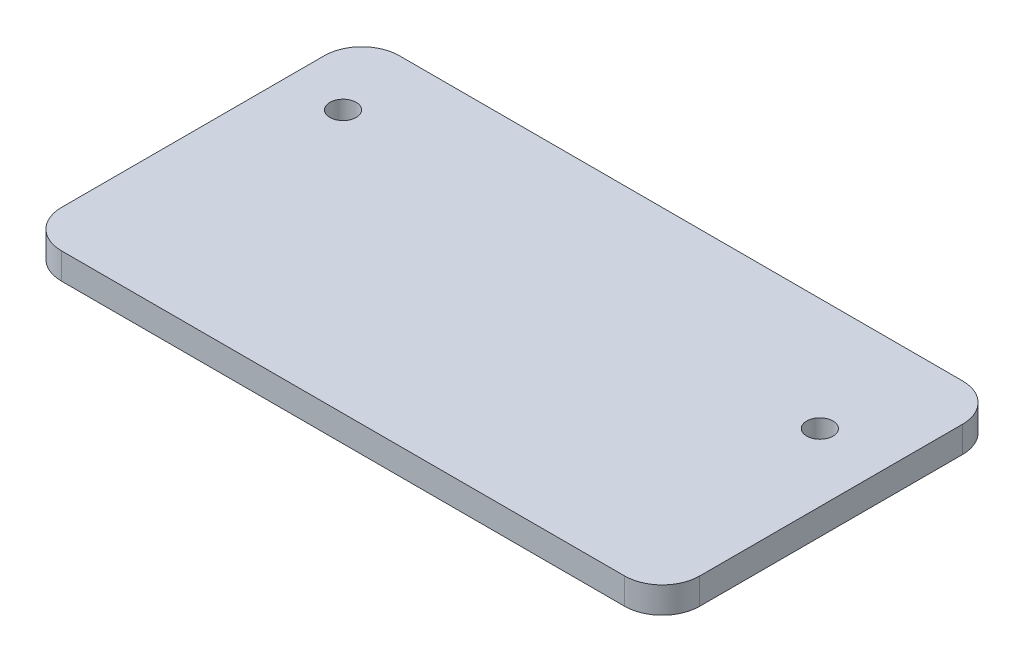
ISO-10303-21;
HEADER;
FILE_DESCRIPTION(('STEP AP214'),'2;1');
FILE_NAME('part.step','',(''),(''),'','','');
FILE_SCHEMA(('AUTOMOTIVE_DESIGN { 1 0 10303 214 1 1 1 1 }'));
ENDSEC;
DATA;
#1=APPLICATION_CONTEXT('core data for automotive mechanical design processes');
#2=APPLICATION_PROTOCOL_DEFINITION('international standard','automotive_design',2000,#1);
#3=PRODUCT_CONTEXT('',#1,'mechanical');
#4=PRODUCT('Part','Part','',(#3));
#5=PRODUCT_RELATED_PRODUCT_CATEGORY('part','',(#4));
#6=PRODUCT_DEFINITION_FORMATION('','',#4);
#7=PRODUCT_DEFINITION_CONTEXT('part definition',#1,'design');
#8=PRODUCT_DEFINITION('design','',#6,#7);
#9=PRODUCT_DEFINITION_SHAPE('','',#8);
#10=(LENGTH_UNIT() NAMED_UNIT(*) SI_UNIT(.MILLI.,.METRE.));
#11=(NAMED_UNIT(*) PLANE_ANGLE_UNIT() SI_UNIT($,.RADIAN.));
#12=(NAMED_UNIT(*) SI_UNIT($,.STERADIAN.) SOLID_ANGLE_UNIT());
#13=UNCERTAINTY_MEASURE_WITH_UNIT(LENGTH_MEASURE(1.E-05),#10,'distance_accuracy_value','');
#14=(GEOMETRIC_REPRESENTATION_CONTEXT(3) GLOBAL_UNCERTAINTY_ASSIGNED_CONTEXT((#13)) GLOBAL_UNIT_ASSIGNED_CONTEXT((#10,
#11,#12)) REPRESENTATION_CONTEXT('',''));
#15=CARTESIAN_POINT('',(0.,0.,0.));
#16=DIRECTION('',(0.,0.,1.));
#17=DIRECTION('',(1.,0.,0.));
#18=AXIS2_PLACEMENT_3D('',#15,#16,#17);
#19=CARTESIAN_POINT('',(-37.5,3.5,-17.5));
#20=DIRECTION('',(0.,-1.,0.));
#21=DIRECTION('',(0.,0.,-1.));
#22=AXIS2_PLACEMENT_3D('',#19,#20,#21);
#23=PLANE('',#22);
#24=CARTESIAN_POINT('',(-37.5,3.5,-17.5));
#25=DIRECTION('',(0.,-1.,0.));
#26=DIRECTION('',(0.,0.,-1.));
#27=AXIS2_PLACEMENT_3D('',#24,#25,#26);
#28=CIRCLE('',#27,5.);
#29=CARTESIAN_POINT('',(-42.5,3.5,-17.5));
#30=VERTEX_POINT('',#29);
#31=CARTESIAN_POINT('',(-37.5,3.5,-22.5));
#32=VERTEX_POINT('',#31);
#33=EDGE_CURVE('E227',#30,#32,#28,.T.);
#34=ORIENTED_EDGE('',*,*,#33,.F.);
#35=DIRECTION('',(0.,0.,1.));
#36=VECTOR('',#35,1.);
#37=CARTESIAN_POINT('',(-42.5,3.5,-17.5));
#38=LINE('',#37,#36);
#39=CARTESIAN_POINT('',(-42.5,3.5,17.5));
#40=VERTEX_POINT('',#39);
#41=EDGE_CURVE('E192',#30,#40,#38,.T.);
#42=ORIENTED_EDGE('',*,*,#41,.T.);
#43=CARTESIAN_POINT('',(-37.5,3.5,17.5));
#44=DIRECTION('',(0.,-1.,0.));
#45=DIRECTION('',(0.,0.,-1.));
#46=AXIS2_PLACEMENT_3D('',#43,#44,#45);
#47=CIRCLE('',#46,5.);
#48=CARTESIAN_POINT('',(-37.5,3.5,22.5));
#49=VERTEX_POINT('',#48);
#50=EDGE_CURVE('E172',#49,#40,#47,.T.);
#51=ORIENTED_EDGE('',*,*,#50,.F.);
#52=DIRECTION('',(1.,0.,0.));
#53=VECTOR('',#52,1.);
#54=CARTESIAN_POINT('',(-37.5,3.5,22.5));
#55=LINE('',#54,#53);
#56=CARTESIAN_POINT('',(37.5,3.5,22.5));
#57=VERTEX_POINT('',#56);
#58=EDGE_CURVE('E182',#49,#57,#55,.T.);
#59=ORIENTED_EDGE('',*,*,#58,.T.);
#60=CARTESIAN_POINT('',(37.5,3.5,17.5));
#61=DIRECTION('',(0.,-1.,0.));
#62=DIRECTION('',(0.,0.,-1.));
#63=AXIS2_PLACEMENT_3D('',#60,#61,#62);
#64=CIRCLE('',#63,5.);
#65=CARTESIAN_POINT('',(42.5,3.5,17.5));
#66=VERTEX_POINT('',#65);
#67=EDGE_CURVE('E188',#66,#57,#64,.T.);
#68=ORIENTED_EDGE('',*,*,#67,.F.);
#69=DIRECTION('',(0.,0.,1.));
#70=VECTOR('',#69,1.);
#71=CARTESIAN_POINT('',(42.5,3.5,-17.5));
#72=LINE('',#71,#70);
#73=CARTESIAN_POINT('',(42.5,3.5,-17.5));
#74=VERTEX_POINT('',#73);
#75=EDGE_CURVE('E261',#74,#66,#72,.T.);
#76=ORIENTED_EDGE('',*,*,#75,.F.);
#77=CARTESIAN_POINT('',(37.5,3.5,-17.5));
#78=DIRECTION('',(0.,-1.,0.));
#79=DIRECTION('',(0.,0.,-1.));
#80=AXIS2_PLACEMENT_3D('',#77,#78,#79);
#81=CIRCLE('',#80,5.);
#82=CARTESIAN_POINT('',(37.5,3.5,-22.5));
#83=VERTEX_POINT('',#82);
#84=EDGE_CURVE('E252',#83,#74,#81,.T.);
#85=ORIENTED_EDGE('',*,*,#84,.F.);
#86=DIRECTION('',(1.,0.,0.));
#87=VECTOR('',#86,1.);
#88=CARTESIAN_POINT('',(-37.5,3.5,-22.5));
#89=LINE('',#88,#87);
#90=EDGE_CURVE('E248',#32,#83,#89,.T.);
#91=ORIENTED_EDGE('',*,*,#90,.F.);
#92=EDGE_LOOP('',(#34,#42,#51,#59,#68,#76,#85,#91));
#93=FACE_BOUND('',#92,.T.);
#94=CARTESIAN_POINT('',(-35.,3.5,-12.5));
#95=DIRECTION('',(0.,1.,0.));
#96=DIRECTION('',(0.,0.,1.));
#97=AXIS2_PLACEMENT_3D('',#94,#95,#96);
#98=CIRCLE('',#97,1.75);
#99=CARTESIAN_POINT('',(-35.,3.5,-10.75));
#100=VERTEX_POINT('',#99);
#101=EDGE_CURVE('E204',#100,#100,#98,.T.);
#102=ORIENTED_EDGE('',*,*,#101,.F.);
#103=EDGE_LOOP('',(#102));
#104=FACE_BOUND('',#103,.T.);
#105=CARTESIAN_POINT('',(33.5,3.5,-7.5));
#106=DIRECTION('',(0.,1.,0.));
#107=DIRECTION('',(0.,0.,1.));
#108=AXIS2_PLACEMENT_3D('',#105,#106,#107);
#109=CIRCLE('',#108,1.75);
#110=CARTESIAN_POINT('',(33.5,3.5,-5.75));
#111=VERTEX_POINT('',#110);
#112=EDGE_CURVE('E400',#111,#111,#109,.T.);
#113=ORIENTED_EDGE('',*,*,#112,.F.);
#114=EDGE_LOOP('',(#113));
#115=FACE_BOUND('',#114,.T.);
#116=ADVANCED_FACE('F97',(#93,#104,#115),#23,.F.);
#117=CARTESIAN_POINT('',(-37.5,0.,-17.5));
#118=DIRECTION('',(0.,-1.,0.));
#119=DIRECTION('',(0.,0.,-1.));
#120=AXIS2_PLACEMENT_3D('',#117,#118,#119);
#121=PLANE('',#120);
#122=CARTESIAN_POINT('',(-35.,0.,-12.5));
#123=DIRECTION('',(0.,1.,0.));
#124=DIRECTION('',(0.,0.,1.));
#125=AXIS2_PLACEMENT_3D('',#122,#123,#124);
#126=CIRCLE('',#125,1.75);
#127=CARTESIAN_POINT('',(-35.,0.,-10.75));
#128=VERTEX_POINT('',#127);
#129=EDGE_CURVE('E255',#128,#128,#126,.T.);
#130=ORIENTED_EDGE('',*,*,#129,.T.);
#131=EDGE_LOOP('',(#130));
#132=FACE_BOUND('',#131,.T.);
#133=CARTESIAN_POINT('',(-37.5,0.,-17.5));
#134=DIRECTION('',(0.,-1.,0.));
#135=DIRECTION('',(0.,0.,-1.));
#136=AXIS2_PLACEMENT_3D('',#133,#134,#135);
#137=CIRCLE('',#136,5.);
#138=CARTESIAN_POINT('',(-42.5,0.,-17.5));
#139=VERTEX_POINT('',#138);
#140=CARTESIAN_POINT('',(-37.5,0.,-22.5));
#141=VERTEX_POINT('',#140);
#142=EDGE_CURVE('E199',#139,#141,#137,.T.);
#143=ORIENTED_EDGE('',*,*,#142,.T.);
#144=DIRECTION('',(1.,0.,0.));
#145=VECTOR('',#144,1.);
#146=CARTESIAN_POINT('',(-37.5,0.,-22.5));
#147=LINE('',#146,#145);
#148=CARTESIAN_POINT('',(37.5,0.,-22.5));
#149=VERTEX_POINT('',#148);
#150=EDGE_CURVE('E203',#141,#149,#147,.T.);
#151=ORIENTED_EDGE('',*,*,#150,.T.);
#152=CARTESIAN_POINT('',(37.5,0.,-17.5));
#153=DIRECTION('',(0.,-1.,0.));
#154=DIRECTION('',(0.,0.,-1.));
#155=AXIS2_PLACEMENT_3D('',#152,#153,#154);
#156=CIRCLE('',#155,5.);
#157=CARTESIAN_POINT('',(42.5,0.,-17.5));
#158=VERTEX_POINT('',#157);
#159=EDGE_CURVE('E208',#149,#158,#156,.T.);
#160=ORIENTED_EDGE('',*,*,#159,.T.);
#161=DIRECTION('',(0.,0.,1.));
#162=VECTOR('',#161,1.);
#163=CARTESIAN_POINT('',(42.5,0.,-17.5));
#164=LINE('',#163,#162);
#165=CARTESIAN_POINT('',(42.5,0.,17.5));
#166=VERTEX_POINT('',#165);
#167=EDGE_CURVE('E212',#158,#166,#164,.T.);
#168=ORIENTED_EDGE('',*,*,#167,.T.);
#169=CARTESIAN_POINT('',(37.5,0.,17.5));
#170=DIRECTION('',(0.,-1.,0.));
#171=DIRECTION('',(0.,0.,-1.));
#172=AXIS2_PLACEMENT_3D('',#169,#170,#171);
#173=CIRCLE('',#172,5.);
#174=CARTESIAN_POINT('',(37.5,0.,22.5));
#175=VERTEX_POINT('',#174);
#176=EDGE_CURVE('E216',#166,#175,#173,.T.);
#177=ORIENTED_EDGE('',*,*,#176,.T.);
#178=DIRECTION('',(1.,0.,0.));
#179=VECTOR('',#178,1.);
#180=CARTESIAN_POINT('',(-37.5,0.,22.5));
#181=LINE('',#180,#179);
#182=CARTESIAN_POINT('',(-37.5,0.,22.5));
#183=VERTEX_POINT('',#182);
#184=EDGE_CURVE('E220',#183,#175,#181,.T.);
#185=ORIENTED_EDGE('',*,*,#184,.F.);
#186=CARTESIAN_POINT('',(-37.5,0.,17.5));
#187=DIRECTION('',(0.,-1.,0.));
#188=DIRECTION('',(0.,0.,-1.));
#189=AXIS2_PLACEMENT_3D('',#186,#187,#188);
#190=CIRCLE('',#189,5.);
#191=CARTESIAN_POINT('',(-42.5,0.,17.5));
#192=VERTEX_POINT('',#191);
#193=EDGE_CURVE('E174',#183,#192,#190,.T.);
#194=ORIENTED_EDGE('',*,*,#193,.T.);
#195=DIRECTION('',(0.,0.,1.));
#196=VECTOR('',#195,1.);
#197=CARTESIAN_POINT('',(-42.5,0.,-17.5));
#198=LINE('',#197,#196);
#199=EDGE_CURVE('E225',#139,#192,#198,.T.);
#200=ORIENTED_EDGE('',*,*,#199,.F.);
#201=EDGE_LOOP('',(#143,#151,#160,#168,#177,#185,#194,#200));
#202=FACE_BOUND('',#201,.T.);
#203=CARTESIAN_POINT('',(33.5,0.,-7.5));
#204=DIRECTION('',(0.,1.,0.));
#205=DIRECTION('',(0.,0.,1.));
#206=AXIS2_PLACEMENT_3D('',#203,#204,#205);
#207=CIRCLE('',#206,1.75);
#208=CARTESIAN_POINT('',(33.5,0.,-5.75));
#209=VERTEX_POINT('',#208);
#210=EDGE_CURVE('E403',#209,#209,#207,.T.);
#211=ORIENTED_EDGE('',*,*,#210,.T.);
#212=EDGE_LOOP('',(#211));
#213=FACE_BOUND('',#212,.T.);
#214=ADVANCED_FACE('F244',(#132,#202,#213),#121,.T.);
#215=CARTESIAN_POINT('',(-37.5,3.5,-17.5));
#216=DIRECTION('',(0.,-1.,0.));
#217=DIRECTION('',(0.,0.,-1.));
#218=AXIS2_PLACEMENT_3D('',#215,#216,#217);
#219=CYLINDRICAL_SURFACE('',#218,5.);
#220=ORIENTED_EDGE('',*,*,#142,.F.);
#221=DIRECTION('',(0.,-1.,0.));
#222=VECTOR('',#221,1.);
#223=CARTESIAN_POINT('',(-42.5,3.5,-17.5));
#224=LINE('',#223,#222);
#225=EDGE_CURVE('E12',#30,#139,#224,.T.);
#226=ORIENTED_EDGE('',*,*,#225,.F.);
#227=ORIENTED_EDGE('',*,*,#33,.T.);
#228=DIRECTION('',(0.,-1.,0.));
#229=VECTOR('',#228,1.);
#230=CARTESIAN_POINT('',(-37.5,3.5,-22.5));
#231=LINE('',#230,#229);
#232=EDGE_CURVE('E101',#32,#141,#231,.T.);
#233=ORIENTED_EDGE('',*,*,#232,.T.);
#234=EDGE_LOOP('',(#220,#226,#227,#233));
#235=FACE_BOUND('',#234,.T.);
#236=ADVANCED_FACE('F99',(#235),#219,.T.);
#237=CARTESIAN_POINT('',(-42.5,3.5,-17.5));
#238=DIRECTION('',(1.,0.,0.));
#239=DIRECTION('',(0.,0.,-1.));
#240=AXIS2_PLACEMENT_3D('',#237,#238,#239);
#241=PLANE('',#240);
#242=ORIENTED_EDGE('',*,*,#199,.T.);
#243=DIRECTION('',(0.,-1.,0.));
#244=VECTOR('',#243,1.);
#245=CARTESIAN_POINT('',(-42.5,3.5,17.5));
#246=LINE('',#245,#244);
#247=EDGE_CURVE('E108',#40,#192,#246,.T.);
#248=ORIENTED_EDGE('',*,*,#247,.F.);
#249=ORIENTED_EDGE('',*,*,#41,.F.);
#250=ORIENTED_EDGE('',*,*,#225,.T.);
#251=EDGE_LOOP('',(#242,#248,#249,#250));
#252=FACE_BOUND('',#251,.T.);
#253=ADVANCED_FACE('F246',(#252),#241,.F.);
#254=CARTESIAN_POINT('',(-37.5,3.5,17.5));
#255=DIRECTION('',(0.,-1.,0.));
#256=DIRECTION('',(0.,0.,-1.));
#257=AXIS2_PLACEMENT_3D('',#254,#255,#256);
#258=CYLINDRICAL_SURFACE('',#257,5.);
#259=ORIENTED_EDGE('',*,*,#193,.F.);
#260=DIRECTION('',(0.,-1.,0.));
#261=VECTOR('',#260,1.);
#262=CARTESIAN_POINT('',(-37.5,3.5,22.5));
#263=LINE('',#262,#261);
#264=EDGE_CURVE('E168',#49,#183,#263,.T.);
#265=ORIENTED_EDGE('',*,*,#264,.F.);
#266=ORIENTED_EDGE('',*,*,#50,.T.);
#267=ORIENTED_EDGE('',*,*,#247,.T.);
#268=EDGE_LOOP('',(#259,#265,#266,#267));
#269=FACE_BOUND('',#268,.T.);
#270=ADVANCED_FACE('F170',(#269),#258,.T.);
#271=CARTESIAN_POINT('',(-37.5,3.5,22.5));
#272=DIRECTION('',(0.,0.,-1.));
#273=DIRECTION('',(-1.,0.,0.));
#274=AXIS2_PLACEMENT_3D('',#271,#272,#273);
#275=PLANE('',#274);
#276=ORIENTED_EDGE('',*,*,#184,.T.);
#277=DIRECTION('',(0.,-1.,0.));
#278=VECTOR('',#277,1.);
#279=CARTESIAN_POINT('',(37.5,3.5,22.5));
#280=LINE('',#279,#278);
#281=EDGE_CURVE('E179',#57,#175,#280,.T.);
#282=ORIENTED_EDGE('',*,*,#281,.F.);
#283=ORIENTED_EDGE('',*,*,#58,.F.);
#284=ORIENTED_EDGE('',*,*,#264,.T.);
#285=EDGE_LOOP('',(#276,#282,#283,#284));
#286=FACE_BOUND('',#285,.T.);
#287=ADVANCED_FACE('F183',(#286),#275,.F.);
#288=CARTESIAN_POINT('',(37.5,3.5,17.5));
#289=DIRECTION('',(0.,-1.,0.));
#290=DIRECTION('',(0.,0.,-1.));
#291=AXIS2_PLACEMENT_3D('',#288,#289,#290);
#292=CYLINDRICAL_SURFACE('',#291,5.);
#293=ORIENTED_EDGE('',*,*,#176,.F.);
#294=DIRECTION('',(0.,-1.,0.));
#295=VECTOR('',#294,1.);
#296=CARTESIAN_POINT('',(42.5,3.5,17.5));
#297=LINE('',#296,#295);
#298=EDGE_CURVE('E233',#66,#166,#297,.T.);
#299=ORIENTED_EDGE('',*,*,#298,.F.);
#300=ORIENTED_EDGE('',*,*,#67,.T.);
#301=ORIENTED_EDGE('',*,*,#281,.T.);
#302=EDGE_LOOP('',(#293,#299,#300,#301));
#303=FACE_BOUND('',#302,.T.);
#304=ADVANCED_FACE('F267',(#303),#292,.T.);
#305=CARTESIAN_POINT('',(42.5,3.5,-17.5));
#306=DIRECTION('',(1.,0.,0.));
#307=DIRECTION('',(0.,0.,-1.));
#308=AXIS2_PLACEMENT_3D('',#305,#306,#307);
#309=PLANE('',#308);
#310=ORIENTED_EDGE('',*,*,#167,.F.);
#311=DIRECTION('',(0.,-1.,0.));
#312=VECTOR('',#311,1.);
#313=CARTESIAN_POINT('',(42.5,3.5,-17.5));
#314=LINE('',#313,#312);
#315=EDGE_CURVE('E236',#74,#158,#314,.T.);
#316=ORIENTED_EDGE('',*,*,#315,.F.);
#317=ORIENTED_EDGE('',*,*,#75,.T.);
#318=ORIENTED_EDGE('',*,*,#298,.T.);
#319=EDGE_LOOP('',(#310,#316,#317,#318));
#320=FACE_BOUND('',#319,.T.);
#321=ADVANCED_FACE('F271',(#320),#309,.T.);
#322=CARTESIAN_POINT('',(37.5,3.5,-17.5));
#323=DIRECTION('',(0.,-1.,0.));
#324=DIRECTION('',(0.,0.,-1.));
#325=AXIS2_PLACEMENT_3D('',#322,#323,#324);
#326=CYLINDRICAL_SURFACE('',#325,5.);
#327=ORIENTED_EDGE('',*,*,#159,.F.);
#328=DIRECTION('',(0.,-1.,0.));
#329=VECTOR('',#328,1.);
#330=CARTESIAN_POINT('',(37.5,3.5,-22.5));
#331=LINE('',#330,#329);
#332=EDGE_CURVE('E238',#83,#149,#331,.T.);
#333=ORIENTED_EDGE('',*,*,#332,.F.);
#334=ORIENTED_EDGE('',*,*,#84,.T.);
#335=ORIENTED_EDGE('',*,*,#315,.T.);
#336=EDGE_LOOP('',(#327,#333,#334,#335));
#337=FACE_BOUND('',#336,.T.);
#338=ADVANCED_FACE('F273',(#337),#326,.T.);
#339=CARTESIAN_POINT('',(-37.5,3.5,-22.5));
#340=DIRECTION('',(0.,0.,-1.));
#341=DIRECTION('',(-1.,0.,0.));
#342=AXIS2_PLACEMENT_3D('',#339,#340,#341);
#343=PLANE('',#342);
#344=ORIENTED_EDGE('',*,*,#150,.F.);
#345=ORIENTED_EDGE('',*,*,#232,.F.);
#346=ORIENTED_EDGE('',*,*,#90,.T.);
#347=ORIENTED_EDGE('',*,*,#332,.T.);
#348=EDGE_LOOP('',(#344,#345,#346,#347));
#349=FACE_BOUND('',#348,.T.);
#350=ADVANCED_FACE('F242',(#349),#343,.T.);
#351=CARTESIAN_POINT('',(-35.,3.5,-12.5));
#352=DIRECTION('',(0.,-1.,0.));
#353=DIRECTION('',(0.,0.,-1.));
#354=AXIS2_PLACEMENT_3D('',#351,#352,#353);
#355=CYLINDRICAL_SURFACE('',#354,1.75);
#356=ORIENTED_EDGE('',*,*,#101,.T.);
#357=EDGE_LOOP('',(#356));
#358=FACE_BOUND('',#357,.T.);
#359=ORIENTED_EDGE('',*,*,#129,.F.);
#360=EDGE_LOOP('',(#359));
#361=FACE_BOUND('',#360,.T.);
#362=ADVANCED_FACE('F280',(#358,#361),#355,.F.);
#363=CARTESIAN_POINT('',(33.5,3.5,-7.5));
#364=DIRECTION('',(0.,-1.,0.));
#365=DIRECTION('',(0.,0.,-1.));
#366=AXIS2_PLACEMENT_3D('',#363,#364,#365);
#367=CYLINDRICAL_SURFACE('',#366,1.75);
#368=ORIENTED_EDGE('',*,*,#112,.T.);
#369=EDGE_LOOP('',(#368));
#370=FACE_BOUND('',#369,.T.);
#371=ORIENTED_EDGE('',*,*,#210,.F.);
#372=EDGE_LOOP('',(#371));
#373=FACE_BOUND('',#372,.T.);
#374=ADVANCED_FACE('F329',(#370,#373),#367,.F.);
#375=CLOSED_SHELL('',(#116,#214,#236,#253,#270,#287,#304,#321,#338,#350,#362,#374));
#376=MANIFOLD_SOLID_BREP('B2',#375);
#377=ADVANCED_BREP_SHAPE_REPRESENTATION('',(#18,#376),#14);
#378=SHAPE_DEFINITION_REPRESENTATION(#9,#377);
ENDSEC;
END-ISO-10303-21;
